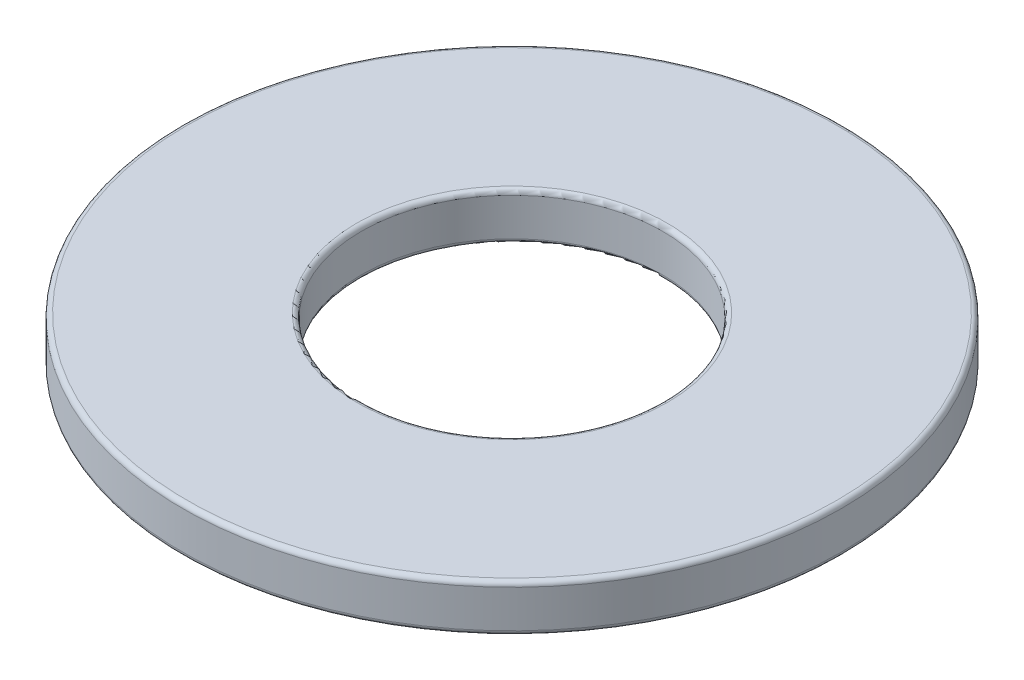
ISO-10303-21;
HEADER;
FILE_DESCRIPTION(('STEP AP214'),'2;1');
FILE_NAME('part.step','',(''),(''),'','','');
FILE_SCHEMA(('AUTOMOTIVE_DESIGN { 1 0 10303 214 1 1 1 1 }'));
ENDSEC;
DATA;
#1=APPLICATION_CONTEXT('core data for automotive mechanical design processes');
#2=APPLICATION_PROTOCOL_DEFINITION('international standard','automotive_design',2000,#1);
#3=PRODUCT_CONTEXT('',#1,'mechanical');
#4=PRODUCT('Part','Part','',(#3));
#5=PRODUCT_RELATED_PRODUCT_CATEGORY('part','',(#4));
#6=PRODUCT_DEFINITION_FORMATION('','',#4);
#7=PRODUCT_DEFINITION_CONTEXT('part definition',#1,'design');
#8=PRODUCT_DEFINITION('design','',#6,#7);
#9=PRODUCT_DEFINITION_SHAPE('','',#8);
#10=(LENGTH_UNIT() NAMED_UNIT(*) SI_UNIT(.MILLI.,.METRE.));
#11=(NAMED_UNIT(*) PLANE_ANGLE_UNIT() SI_UNIT($,.RADIAN.));
#12=(NAMED_UNIT(*) SI_UNIT($,.STERADIAN.) SOLID_ANGLE_UNIT());
#13=UNCERTAINTY_MEASURE_WITH_UNIT(LENGTH_MEASURE(1.E-05),#10,'distance_accuracy_value','');
#14=(GEOMETRIC_REPRESENTATION_CONTEXT(3) GLOBAL_UNCERTAINTY_ASSIGNED_CONTEXT((#13)) GLOBAL_UNIT_ASSIGNED_CONTEXT((#10,
#11,#12)) REPRESENTATION_CONTEXT('',''));
#15=CARTESIAN_POINT('',(0.,0.,0.));
#16=DIRECTION('',(0.,0.,1.));
#17=DIRECTION('',(1.,0.,0.));
#18=AXIS2_PLACEMENT_3D('',#15,#16,#17);
#19=CARTESIAN_POINT('',(0.,0.45,0.));
#20=DIRECTION('',(0.,-1.,0.));
#21=DIRECTION('',(0.,0.,-1.));
#22=AXIS2_PLACEMENT_3D('',#19,#20,#21);
#23=TOROIDAL_SURFACE('',#22,3.45,0.05);
#24=CARTESIAN_POINT('',(0.,0.45,0.));
#25=DIRECTION('',(0.,1.,0.));
#26=DIRECTION('',(1.,0.,0.));
#27=AXIS2_PLACEMENT_3D('',#24,#25,#26);
#28=CIRCLE('',#27,3.5);
#29=CARTESIAN_POINT('',(-3.5,0.45,0.));
#30=VERTEX_POINT('',#29);
#31=EDGE_CURVE('E91',#30,#30,#28,.T.);
#32=ORIENTED_EDGE('',*,*,#31,.T.);
#33=CARTESIAN_POINT('',(-3.45,0.5,0.));
#34=CARTESIAN_POINT('',(-3.465707963268,0.5,0.));
#35=CARTESIAN_POINT('',(-3.481430582168,0.493849249798,0.));
#36=CARTESIAN_POINT('',(-3.493849249798,0.481430582168,0.));
#37=CARTESIAN_POINT('',(-3.5,0.465707963268,0.));
#38=CARTESIAN_POINT('',(-3.5,0.45,0.));
#39=(BOUNDED_CURVE() B_SPLINE_CURVE(5,(#33,#34,#35,#36,#37,#38),.UNSPECIFIED.,.F.,
.F.) B_SPLINE_CURVE_WITH_KNOTS((6,6),(-1.570796326795,0.),
.UNSPECIFIED.) CURVE() GEOMETRIC_REPRESENTATION_ITEM() RATIONAL_B_SPLINE_CURVE((1.,1.,1.,1.,1.,1.)) REPRESENTATION_ITEM(''));
#40=CARTESIAN_POINT('',(-3.45,0.5,0.));
#41=VERTEX_POINT('',#40);
#42=EDGE_CURVE('E11',#41,#30,#39,.T.);
#43=ORIENTED_EDGE('',*,*,#42,.F.);
#44=CARTESIAN_POINT('',(0.,0.5,0.));
#45=DIRECTION('',(0.,-1.,0.));
#46=DIRECTION('',(1.,0.,0.));
#47=AXIS2_PLACEMENT_3D('',#44,#45,#46);
#48=CIRCLE('',#47,3.45);
#49=EDGE_CURVE('E102',#41,#41,#48,.T.);
#50=ORIENTED_EDGE('',*,*,#49,.T.);
#51=ORIENTED_EDGE('',*,*,#42,.T.);
#52=EDGE_LOOP('',(#32,#43,#50,#51));
#53=FACE_BOUND('',#52,.T.);
#54=ADVANCED_FACE('F17',(#53),#23,.T.);
#55=CARTESIAN_POINT('',(0.,0.,0.));
#56=DIRECTION('',(0.,1.,0.));
#57=DIRECTION('',(1.,0.,0.));
#58=AXIS2_PLACEMENT_3D('',#55,#56,#57);
#59=CYLINDRICAL_SURFACE('',#58,3.5);
#60=ORIENTED_EDGE('',*,*,#31,.F.);
#61=CARTESIAN_POINT('',(-3.5,0.05,0.));
#62=CARTESIAN_POINT('',(-3.5,0.45,0.));
#63=(BOUNDED_CURVE() B_SPLINE_CURVE(1,(#61,#62),.UNSPECIFIED.,.F.,
.F.) B_SPLINE_CURVE_WITH_KNOTS((2,2),(0.05,0.45),
.UNSPECIFIED.) CURVE() GEOMETRIC_REPRESENTATION_ITEM() RATIONAL_B_SPLINE_CURVE((1.,1.)) REPRESENTATION_ITEM(''));
#64=CARTESIAN_POINT('',(-3.5,0.05,0.));
#65=VERTEX_POINT('',#64);
#66=EDGE_CURVE('E30',#65,#30,#63,.T.);
#67=ORIENTED_EDGE('',*,*,#66,.F.);
#68=CARTESIAN_POINT('',(0.,0.05,0.));
#69=DIRECTION('',(0.,-1.,0.));
#70=DIRECTION('',(1.,0.,0.));
#71=AXIS2_PLACEMENT_3D('',#68,#69,#70);
#72=CIRCLE('',#71,3.5);
#73=EDGE_CURVE('E107',#65,#65,#72,.T.);
#74=ORIENTED_EDGE('',*,*,#73,.F.);
#75=ORIENTED_EDGE('',*,*,#66,.T.);
#76=EDGE_LOOP('',(#60,#67,#74,#75));
#77=FACE_BOUND('',#76,.T.);
#78=ADVANCED_FACE('F215',(#77),#59,.T.);
#79=CARTESIAN_POINT('',(0.,0.5,0.));
#80=DIRECTION('',(0.,-1.,0.));
#81=DIRECTION('',(0.,0.,-1.));
#82=AXIS2_PLACEMENT_3D('',#79,#80,#81);
#83=PLANE('',#82);
#84=ORIENTED_EDGE('',*,*,#49,.F.);
#85=EDGE_LOOP('',(#84));
#86=FACE_BOUND('',#85,.T.);
#87=CARTESIAN_POINT('',(0.,0.5,0.));
#88=DIRECTION('',(0.,1.,0.));
#89=DIRECTION('',(1.,0.,0.));
#90=AXIS2_PLACEMENT_3D('',#87,#88,#89);
#91=CIRCLE('',#90,1.65);
#92=CARTESIAN_POINT('',(-1.65,0.5,0.));
#93=VERTEX_POINT('',#92);
#94=EDGE_CURVE('E85',#93,#93,#91,.T.);
#95=ORIENTED_EDGE('',*,*,#94,.F.);
#96=EDGE_LOOP('',(#95));
#97=FACE_BOUND('',#96,.T.);
#98=ADVANCED_FACE('F185',(#86,#97),#83,.F.);
#99=CARTESIAN_POINT('',(0.,0.05,0.));
#100=DIRECTION('',(0.,-1.,0.));
#101=DIRECTION('',(0.,0.,-1.));
#102=AXIS2_PLACEMENT_3D('',#99,#100,#101);
#103=TOROIDAL_SURFACE('',#102,3.45,0.05);
#104=CARTESIAN_POINT('',(0.,0.,0.));
#105=DIRECTION('',(0.,1.,0.));
#106=DIRECTION('',(1.,0.,0.));
#107=AXIS2_PLACEMENT_3D('',#104,#105,#106);
#108=CIRCLE('',#107,3.45);
#109=CARTESIAN_POINT('',(-3.45,0.,0.));
#110=VERTEX_POINT('',#109);
#111=EDGE_CURVE('E120',#110,#110,#108,.T.);
#112=ORIENTED_EDGE('',*,*,#111,.T.);
#113=CARTESIAN_POINT('',(-3.5,0.05,0.));
#114=CARTESIAN_POINT('',(-3.5,0.03429203673205,0.));
#115=CARTESIAN_POINT('',(-3.493849249798,0.01856941783185,0.));
#116=CARTESIAN_POINT('',(-3.481430582168,0.006150750202287,0.));
#117=CARTESIAN_POINT('',(-3.465707963268,0.,0.));
#118=CARTESIAN_POINT('',(-3.45,0.,0.));
#119=(BOUNDED_CURVE() B_SPLINE_CURVE(5,(#113,#114,#115,#116,#117,#118),.UNSPECIFIED.,.F.,
.F.) B_SPLINE_CURVE_WITH_KNOTS((6,6),(0.,1.570796326795),
.UNSPECIFIED.) CURVE() GEOMETRIC_REPRESENTATION_ITEM() RATIONAL_B_SPLINE_CURVE((1.,1.,1.,1.,1.,1.)) REPRESENTATION_ITEM(''));
#120=EDGE_CURVE('E110',#65,#110,#119,.T.);
#121=ORIENTED_EDGE('',*,*,#120,.F.);
#122=ORIENTED_EDGE('',*,*,#73,.T.);
#123=ORIENTED_EDGE('',*,*,#120,.T.);
#124=EDGE_LOOP('',(#112,#121,#122,#123));
#125=FACE_BOUND('',#124,.T.);
#126=ADVANCED_FACE('F180',(#125),#103,.T.);
#127=CARTESIAN_POINT('',(0.,0.,0.));
#128=DIRECTION('',(0.,-1.,0.));
#129=DIRECTION('',(0.,0.,-1.));
#130=AXIS2_PLACEMENT_3D('',#127,#128,#129);
#131=PLANE('',#130);
#132=ORIENTED_EDGE('',*,*,#111,.F.);
#133=EDGE_LOOP('',(#132));
#134=FACE_BOUND('',#133,.T.);
#135=CARTESIAN_POINT('',(0.,0.,0.));
#136=DIRECTION('',(0.,-1.,0.));
#137=DIRECTION('',(1.,0.,0.));
#138=AXIS2_PLACEMENT_3D('',#135,#136,#137);
#139=CIRCLE('',#138,1.65);
#140=CARTESIAN_POINT('',(-1.65,0.,0.));
#141=VERTEX_POINT('',#140);
#142=EDGE_CURVE('E125',#141,#141,#139,.T.);
#143=ORIENTED_EDGE('',*,*,#142,.F.);
#144=EDGE_LOOP('',(#143));
#145=FACE_BOUND('',#144,.T.);
#146=ADVANCED_FACE('F184',(#134,#145),#131,.T.);
#147=CARTESIAN_POINT('',(0.,0.05,0.));
#148=DIRECTION('',(0.,1.,0.));
#149=DIRECTION('',(0.,0.,1.));
#150=AXIS2_PLACEMENT_3D('',#147,#148,#149);
#151=TOROIDAL_SURFACE('',#150,1.65,0.05);
#152=ORIENTED_EDGE('',*,*,#142,.T.);
#153=CARTESIAN_POINT('',(-1.6,0.05,0.));
#154=CARTESIAN_POINT('',(-1.6,0.03429203673205,0.));
#155=CARTESIAN_POINT('',(-1.606150750202,0.01856941783186,0.));
#156=CARTESIAN_POINT('',(-1.618569417832,0.006150750202287,0.));
#157=CARTESIAN_POINT('',(-1.634292036732,0.,0.));
#158=CARTESIAN_POINT('',(-1.65,0.,0.));
#159=(BOUNDED_CURVE() B_SPLINE_CURVE(5,(#153,#154,#155,#156,#157,#158),.UNSPECIFIED.,.F.,
.F.) B_SPLINE_CURVE_WITH_KNOTS((6,6),(3.14159265359,4.712388980385),
.UNSPECIFIED.) CURVE() GEOMETRIC_REPRESENTATION_ITEM() RATIONAL_B_SPLINE_CURVE((1.,1.,1.,1.,1.,1.)) REPRESENTATION_ITEM(''));
#160=CARTESIAN_POINT('',(-1.6,0.05,0.));
#161=VERTEX_POINT('',#160);
#162=EDGE_CURVE('E21',#161,#141,#159,.T.);
#163=ORIENTED_EDGE('',*,*,#162,.F.);
#164=CARTESIAN_POINT('',(0.,0.05,0.));
#165=DIRECTION('',(0.,1.,0.));
#166=DIRECTION('',(1.,0.,0.));
#167=AXIS2_PLACEMENT_3D('',#164,#165,#166);
#168=CIRCLE('',#167,1.6);
#169=EDGE_CURVE('E72',#161,#161,#168,.T.);
#170=ORIENTED_EDGE('',*,*,#169,.T.);
#171=ORIENTED_EDGE('',*,*,#162,.T.);
#172=EDGE_LOOP('',(#152,#163,#170,#171));
#173=FACE_BOUND('',#172,.T.);
#174=ADVANCED_FACE('F153',(#173),#151,.T.);
#175=CARTESIAN_POINT('',(0.,0.,0.));
#176=DIRECTION('',(0.,1.,0.));
#177=DIRECTION('',(1.,0.,0.));
#178=AXIS2_PLACEMENT_3D('',#175,#176,#177);
#179=CYLINDRICAL_SURFACE('',#178,1.6);
#180=CARTESIAN_POINT('',(-1.6,0.05,0.));
#181=CARTESIAN_POINT('',(-1.6,0.45,0.));
#182=(BOUNDED_CURVE() B_SPLINE_CURVE(1,(#180,#181),.UNSPECIFIED.,.F.,
.F.) B_SPLINE_CURVE_WITH_KNOTS((2,2),(0.05,0.45),
.UNSPECIFIED.) CURVE() GEOMETRIC_REPRESENTATION_ITEM() RATIONAL_B_SPLINE_CURVE((1.,1.)) REPRESENTATION_ITEM(''));
#183=CARTESIAN_POINT('',(-1.6,0.45,0.));
#184=VERTEX_POINT('',#183);
#185=EDGE_CURVE('E67',#161,#184,#182,.T.);
#186=ORIENTED_EDGE('',*,*,#185,.T.);
#187=CARTESIAN_POINT('',(0.,0.45,0.));
#188=DIRECTION('',(0.,-1.,0.));
#189=DIRECTION('',(1.,0.,0.));
#190=AXIS2_PLACEMENT_3D('',#187,#188,#189);
#191=CIRCLE('',#190,1.6);
#192=EDGE_CURVE('E69',#184,#184,#191,.T.);
#193=ORIENTED_EDGE('',*,*,#192,.F.);
#194=ORIENTED_EDGE('',*,*,#185,.F.);
#195=ORIENTED_EDGE('',*,*,#169,.F.);
#196=EDGE_LOOP('',(#186,#193,#194,#195));
#197=FACE_BOUND('',#196,.T.);
#198=ADVANCED_FACE('F19',(#197),#179,.F.);
#199=CARTESIAN_POINT('',(0.,0.45,0.));
#200=DIRECTION('',(0.,-1.,0.));
#201=DIRECTION('',(0.,0.,-1.));
#202=AXIS2_PLACEMENT_3D('',#199,#200,#201);
#203=TOROIDAL_SURFACE('',#202,1.65,0.05);
#204=ORIENTED_EDGE('',*,*,#94,.T.);
#205=CARTESIAN_POINT('',(-1.6,0.45,0.));
#206=CARTESIAN_POINT('',(-1.6,0.465707963268,0.));
#207=CARTESIAN_POINT('',(-1.606150750202,0.481430582168,0.));
#208=CARTESIAN_POINT('',(-1.618569417832,0.493849249798,0.));
#209=CARTESIAN_POINT('',(-1.634292036732,0.5,0.));
#210=CARTESIAN_POINT('',(-1.65,0.5,0.));
#211=(BOUNDED_CURVE() B_SPLINE_CURVE(5,(#205,#206,#207,#208,#209,#210),.UNSPECIFIED.,.F.,
.F.) B_SPLINE_CURVE_WITH_KNOTS((6,6),(3.14159265359,4.712388980385),
.UNSPECIFIED.) CURVE() GEOMETRIC_REPRESENTATION_ITEM() RATIONAL_B_SPLINE_CURVE((1.,1.,1.,1.,1.,1.)) REPRESENTATION_ITEM(''));
#212=EDGE_CURVE('E78',#184,#93,#211,.T.);
#213=ORIENTED_EDGE('',*,*,#212,.F.);
#214=ORIENTED_EDGE('',*,*,#192,.T.);
#215=ORIENTED_EDGE('',*,*,#212,.T.);
#216=EDGE_LOOP('',(#204,#213,#214,#215));
#217=FACE_BOUND('',#216,.T.);
#218=ADVANCED_FACE('F77',(#217),#203,.T.);
#219=CLOSED_SHELL('',(#54,#78,#98,#126,#146,#174,#198,#218));
#220=MANIFOLD_SOLID_BREP('B1',#219);
#221=ADVANCED_BREP_SHAPE_REPRESENTATION('',(#18,#220),#14);
#222=SHAPE_DEFINITION_REPRESENTATION(#9,#221);
ENDSEC;
END-ISO-10303-21;
